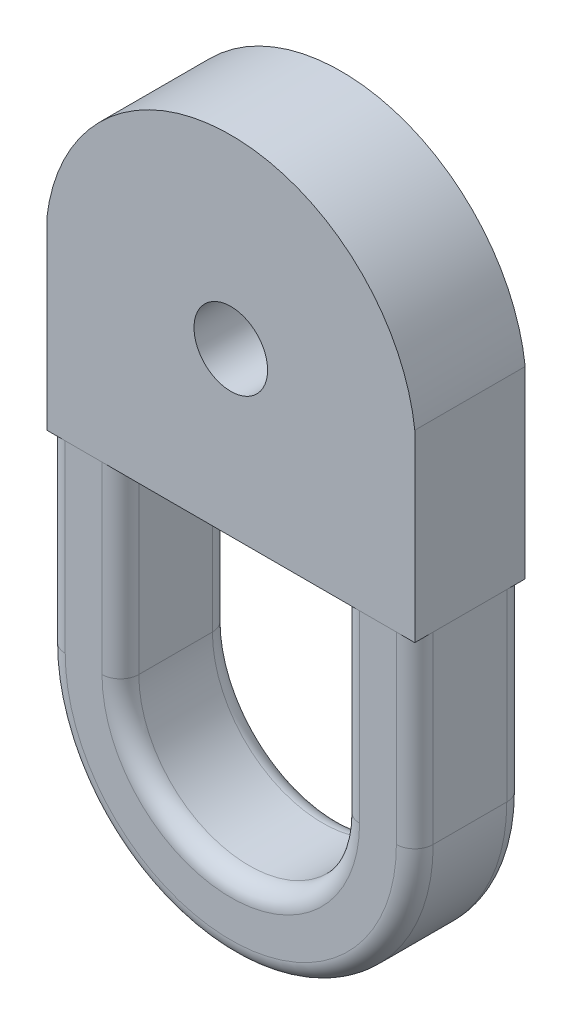
ISO-10303-21;
HEADER;
FILE_DESCRIPTION(('STEP AP214'),'2;1');
FILE_NAME('part.step','',(''),(''),'','','');
FILE_SCHEMA(('AUTOMOTIVE_DESIGN { 1 0 10303 214 1 1 1 1 }'));
ENDSEC;
DATA;
#1=APPLICATION_CONTEXT('core data for automotive mechanical design processes');
#2=APPLICATION_PROTOCOL_DEFINITION('international standard','automotive_design',2000,#1);
#3=PRODUCT_CONTEXT('',#1,'mechanical');
#4=PRODUCT('Part','Part','',(#3));
#5=PRODUCT_RELATED_PRODUCT_CATEGORY('part','',(#4));
#6=PRODUCT_DEFINITION_FORMATION('','',#4);
#7=PRODUCT_DEFINITION_CONTEXT('part definition',#1,'design');
#8=PRODUCT_DEFINITION('design','',#6,#7);
#9=PRODUCT_DEFINITION_SHAPE('','',#8);
#10=(LENGTH_UNIT() NAMED_UNIT(*) SI_UNIT(.MILLI.,.METRE.));
#11=(NAMED_UNIT(*) PLANE_ANGLE_UNIT() SI_UNIT($,.RADIAN.));
#12=(NAMED_UNIT(*) SI_UNIT($,.STERADIAN.) SOLID_ANGLE_UNIT());
#13=UNCERTAINTY_MEASURE_WITH_UNIT(LENGTH_MEASURE(1.E-05),#10,'distance_accuracy_value','');
#14=(GEOMETRIC_REPRESENTATION_CONTEXT(3) GLOBAL_UNCERTAINTY_ASSIGNED_CONTEXT((#13)) GLOBAL_UNIT_ASSIGNED_CONTEXT((#10,
#11,#12)) REPRESENTATION_CONTEXT('',''));
#15=CARTESIAN_POINT('',(0.,0.,0.));
#16=DIRECTION('',(0.,0.,1.));
#17=DIRECTION('',(1.,0.,0.));
#18=AXIS2_PLACEMENT_3D('',#15,#16,#17);
#19=CARTESIAN_POINT('',(5.,-5.,0.));
#20=DIRECTION('',(0.,0.,1.));
#21=DIRECTION('',(1.,0.,0.));
#22=AXIS2_PLACEMENT_3D('',#19,#20,#21);
#23=CYLINDRICAL_SURFACE('',#22,3.);
#24=DIRECTION('',(0.,0.,1.));
#25=VECTOR('',#24,1.);
#26=CARTESIAN_POINT('',(2.,-5.,0.));
#27=LINE('',#26,#25);
#28=CARTESIAN_POINT('',(2.,-5.,0.5));
#29=VERTEX_POINT('',#28);
#30=CARTESIAN_POINT('',(2.,-5.,2.5));
#31=VERTEX_POINT('',#30);
#32=EDGE_CURVE('E272',#29,#31,#27,.T.);
#33=ORIENTED_EDGE('',*,*,#32,.T.);
#34=CARTESIAN_POINT('',(5.,-5.,2.5));
#35=DIRECTION('',(0.,0.,1.));
#36=DIRECTION('',(1.,0.,0.));
#37=AXIS2_PLACEMENT_3D('',#34,#35,#36);
#38=CIRCLE('',#37,3.);
#39=CARTESIAN_POINT('',(8.,-5.,2.5));
#40=VERTEX_POINT('',#39);
#41=EDGE_CURVE('E238',#31,#40,#38,.T.);
#42=ORIENTED_EDGE('',*,*,#41,.T.);
#43=DIRECTION('',(0.,0.,1.));
#44=VECTOR('',#43,1.);
#45=CARTESIAN_POINT('',(8.,-5.,0.));
#46=LINE('',#45,#44);
#47=CARTESIAN_POINT('',(8.,-5.,0.5));
#48=VERTEX_POINT('',#47);
#49=EDGE_CURVE('E284',#48,#40,#46,.T.);
#50=ORIENTED_EDGE('',*,*,#49,.F.);
#51=CARTESIAN_POINT('',(5.,-5.,0.5));
#52=DIRECTION('',(0.,0.,1.));
#53=DIRECTION('',(1.,0.,0.));
#54=AXIS2_PLACEMENT_3D('',#51,#52,#53);
#55=CIRCLE('',#54,3.);
#56=EDGE_CURVE('E68',#48,#29,#55,.F.);
#57=ORIENTED_EDGE('',*,*,#56,.T.);
#58=EDGE_LOOP('',(#33,#42,#50,#57));
#59=FACE_BOUND('',#58,.T.);
#60=ADVANCED_FACE('F46',(#59),#23,.F.);
#61=CARTESIAN_POINT('',(8.,0.,0.));
#62=DIRECTION('',(1.,0.,0.));
#63=DIRECTION('',(0.,0.,-1.));
#64=AXIS2_PLACEMENT_3D('',#61,#62,#63);
#65=PLANE('',#64);
#66=ORIENTED_EDGE('',*,*,#49,.T.);
#67=DIRECTION('',(0.,1.,0.));
#68=VECTOR('',#67,1.);
#69=CARTESIAN_POINT('',(8.,0.,2.5));
#70=LINE('',#69,#68);
#71=CARTESIAN_POINT('',(8.,0.,2.5));
#72=VERTEX_POINT('',#71);
#73=EDGE_CURVE('E234',#40,#72,#70,.T.);
#74=ORIENTED_EDGE('',*,*,#73,.T.);
#75=DIRECTION('',(0.,0.,1.));
#76=VECTOR('',#75,1.);
#77=CARTESIAN_POINT('',(8.,0.,0.));
#78=LINE('',#77,#76);
#79=CARTESIAN_POINT('',(8.,0.,0.5));
#80=VERTEX_POINT('',#79);
#81=EDGE_CURVE('E317',#80,#72,#78,.T.);
#82=ORIENTED_EDGE('',*,*,#81,.F.);
#83=DIRECTION('',(0.,1.,0.));
#84=VECTOR('',#83,1.);
#85=CARTESIAN_POINT('',(8.,0.,0.5));
#86=LINE('',#85,#84);
#87=EDGE_CURVE('E232',#80,#48,#86,.F.);
#88=ORIENTED_EDGE('',*,*,#87,.T.);
#89=EDGE_LOOP('',(#66,#74,#82,#88));
#90=FACE_BOUND('',#89,.T.);
#91=ADVANCED_FACE('F346',(#90),#65,.F.);
#92=CARTESIAN_POINT('',(0.,0.,0.));
#93=DIRECTION('',(0.,-1.,0.));
#94=DIRECTION('',(1.,0.,0.));
#95=AXIS2_PLACEMENT_3D('',#92,#93,#94);
#96=PLANE('',#95);
#97=DIRECTION('',(0.,0.,1.));
#98=VECTOR('',#97,1.);
#99=CARTESIAN_POINT('',(10.,0.,0.));
#100=LINE('',#99,#98);
#101=CARTESIAN_POINT('',(10.,0.,0.5));
#102=VERTEX_POINT('',#101);
#103=CARTESIAN_POINT('',(10.,0.,2.5));
#104=VERTEX_POINT('',#103);
#105=EDGE_CURVE('E310',#102,#104,#100,.T.);
#106=ORIENTED_EDGE('',*,*,#105,.F.);
#107=CARTESIAN_POINT('',(9.5,0.,0.5));
#108=DIRECTION('',(0.,-1.,0.));
#109=DIRECTION('',(1.,0.,0.));
#110=AXIS2_PLACEMENT_3D('',#107,#108,#109);
#111=CIRCLE('',#110,0.5);
#112=CARTESIAN_POINT('',(9.5,0.,0.));
#113=VERTEX_POINT('',#112);
#114=EDGE_CURVE('E230',#102,#113,#111,.F.);
#115=ORIENTED_EDGE('',*,*,#114,.T.);
#116=DIRECTION('',(1.,0.,0.));
#117=VECTOR('',#116,1.);
#118=CARTESIAN_POINT('',(0.,0.,0.));
#119=LINE('',#118,#117);
#120=CARTESIAN_POINT('',(8.5,0.,0.));
#121=VERTEX_POINT('',#120);
#122=EDGE_CURVE('E278',#121,#113,#119,.T.);
#123=ORIENTED_EDGE('',*,*,#122,.F.);
#124=CARTESIAN_POINT('',(8.5,0.,0.5));
#125=DIRECTION('',(0.,-1.,0.));
#126=DIRECTION('',(1.,0.,0.));
#127=AXIS2_PLACEMENT_3D('',#124,#125,#126);
#128=CIRCLE('',#127,0.5);
#129=EDGE_CURVE('E226',#121,#80,#128,.F.);
#130=ORIENTED_EDGE('',*,*,#129,.T.);
#131=ORIENTED_EDGE('',*,*,#81,.T.);
#132=CARTESIAN_POINT('',(8.5,0.,2.5));
#133=DIRECTION('',(0.,-1.,0.));
#134=DIRECTION('',(1.,0.,0.));
#135=AXIS2_PLACEMENT_3D('',#132,#133,#134);
#136=CIRCLE('',#135,0.5);
#137=CARTESIAN_POINT('',(8.5,0.,3.));
#138=VERTEX_POINT('',#137);
#139=EDGE_CURVE('E228',#72,#138,#136,.F.);
#140=ORIENTED_EDGE('',*,*,#139,.T.);
#141=DIRECTION('',(1.,0.,0.));
#142=VECTOR('',#141,1.);
#143=CARTESIAN_POINT('',(0.,0.,3.));
#144=LINE('',#143,#142);
#145=CARTESIAN_POINT('',(9.5,0.,3.));
#146=VERTEX_POINT('',#145);
#147=EDGE_CURVE('E181',#138,#146,#144,.T.);
#148=ORIENTED_EDGE('',*,*,#147,.T.);
#149=CARTESIAN_POINT('',(9.5,0.,2.5));
#150=DIRECTION('',(0.,-1.,0.));
#151=DIRECTION('',(1.,0.,0.));
#152=AXIS2_PLACEMENT_3D('',#149,#150,#151);
#153=CIRCLE('',#152,0.5);
#154=EDGE_CURVE('E224',#146,#104,#153,.F.);
#155=ORIENTED_EDGE('',*,*,#154,.T.);
#156=EDGE_LOOP('',(#106,#115,#123,#130,#131,#140,#148,#155));
#157=FACE_BOUND('',#156,.T.);
#158=ADVANCED_FACE('F296',(#157),#96,.F.);
#159=CARTESIAN_POINT('',(10.,0.,0.));
#160=DIRECTION('',(-1.,0.,0.));
#161=DIRECTION('',(0.,-1.,0.));
#162=AXIS2_PLACEMENT_3D('',#159,#160,#161);
#163=PLANE('',#162);
#164=DIRECTION('',(0.,0.,1.));
#165=VECTOR('',#164,1.);
#166=CARTESIAN_POINT('',(10.,-5.,0.));
#167=LINE('',#166,#165);
#168=CARTESIAN_POINT('',(10.,-5.,0.5));
#169=VERTEX_POINT('',#168);
#170=CARTESIAN_POINT('',(10.,-5.,2.5));
#171=VERTEX_POINT('',#170);
#172=EDGE_CURVE('E308',#169,#171,#167,.T.);
#173=ORIENTED_EDGE('',*,*,#172,.F.);
#174=DIRECTION('',(0.,-1.,0.));
#175=VECTOR('',#174,1.);
#176=CARTESIAN_POINT('',(10.,0.,0.5));
#177=LINE('',#176,#175);
#178=EDGE_CURVE('E222',#169,#102,#177,.F.);
#179=ORIENTED_EDGE('',*,*,#178,.T.);
#180=ORIENTED_EDGE('',*,*,#105,.T.);
#181=DIRECTION('',(0.,-1.,0.));
#182=VECTOR('',#181,1.);
#183=CARTESIAN_POINT('',(10.,-5.,2.5));
#184=LINE('',#183,#182);
#185=EDGE_CURVE('E220',#104,#171,#184,.T.);
#186=ORIENTED_EDGE('',*,*,#185,.T.);
#187=EDGE_LOOP('',(#173,#179,#180,#186));
#188=FACE_BOUND('',#187,.T.);
#189=ADVANCED_FACE('F307',(#188),#163,.F.);
#190=CARTESIAN_POINT('',(5.,-5.,0.));
#191=DIRECTION('',(0.,0.,1.));
#192=DIRECTION('',(1.,0.,0.));
#193=AXIS2_PLACEMENT_3D('',#190,#191,#192);
#194=CYLINDRICAL_SURFACE('',#193,5.);
#195=ORIENTED_EDGE('',*,*,#172,.T.);
#196=CARTESIAN_POINT('',(5.,-5.,2.5));
#197=DIRECTION('',(0.,0.,1.));
#198=DIRECTION('',(1.,0.,0.));
#199=AXIS2_PLACEMENT_3D('',#196,#197,#198);
#200=CIRCLE('',#199,5.);
#201=CARTESIAN_POINT('',(0.,-5.,2.5));
#202=VERTEX_POINT('',#201);
#203=EDGE_CURVE('E204',#171,#202,#200,.F.);
#204=ORIENTED_EDGE('',*,*,#203,.T.);
#205=DIRECTION('',(0.,0.,1.));
#206=VECTOR('',#205,1.);
#207=CARTESIAN_POINT('',(0.,-5.,0.));
#208=LINE('',#207,#206);
#209=CARTESIAN_POINT('',(0.,-5.,0.5));
#210=VERTEX_POINT('',#209);
#211=EDGE_CURVE('E276',#210,#202,#208,.T.);
#212=ORIENTED_EDGE('',*,*,#211,.F.);
#213=CARTESIAN_POINT('',(5.,-5.,0.5));
#214=DIRECTION('',(0.,0.,1.));
#215=DIRECTION('',(1.,0.,0.));
#216=AXIS2_PLACEMENT_3D('',#213,#214,#215);
#217=CIRCLE('',#216,5.);
#218=EDGE_CURVE('E172',#210,#169,#217,.T.);
#219=ORIENTED_EDGE('',*,*,#218,.T.);
#220=EDGE_LOOP('',(#195,#204,#212,#219));
#221=FACE_BOUND('',#220,.T.);
#222=ADVANCED_FACE('F312',(#221),#194,.T.);
#223=CARTESIAN_POINT('',(0.,0.,0.));
#224=DIRECTION('',(-1.,0.,0.));
#225=DIRECTION('',(0.,-1.,0.));
#226=AXIS2_PLACEMENT_3D('',#223,#224,#225);
#227=PLANE('',#226);
#228=ORIENTED_EDGE('',*,*,#211,.T.);
#229=DIRECTION('',(0.,-1.,0.));
#230=VECTOR('',#229,1.);
#231=CARTESIAN_POINT('',(0.,0.,2.5));
#232=LINE('',#231,#230);
#233=CARTESIAN_POINT('',(0.,0.,2.5));
#234=VERTEX_POINT('',#233);
#235=EDGE_CURVE('E191',#202,#234,#232,.F.);
#236=ORIENTED_EDGE('',*,*,#235,.T.);
#237=DIRECTION('',(0.,0.,1.));
#238=VECTOR('',#237,1.);
#239=CARTESIAN_POINT('',(0.,0.,0.));
#240=LINE('',#239,#238);
#241=CARTESIAN_POINT('',(0.,0.,0.5));
#242=VERTEX_POINT('',#241);
#243=EDGE_CURVE('E168',#242,#234,#240,.T.);
#244=ORIENTED_EDGE('',*,*,#243,.F.);
#245=DIRECTION('',(0.,-1.,0.));
#246=VECTOR('',#245,1.);
#247=CARTESIAN_POINT('',(0.,-5.,0.5));
#248=LINE('',#247,#246);
#249=EDGE_CURVE('E188',#242,#210,#248,.T.);
#250=ORIENTED_EDGE('',*,*,#249,.T.);
#251=EDGE_LOOP('',(#228,#236,#244,#250));
#252=FACE_BOUND('',#251,.T.);
#253=ADVANCED_FACE('F334',(#252),#227,.T.);
#254=CARTESIAN_POINT('',(0.,0.,0.));
#255=DIRECTION('',(0.,-1.,0.));
#256=DIRECTION('',(1.,0.,0.));
#257=AXIS2_PLACEMENT_3D('',#254,#255,#256);
#258=PLANE('',#257);
#259=ORIENTED_EDGE('',*,*,#243,.T.);
#260=CARTESIAN_POINT('',(0.5,0.,2.5));
#261=DIRECTION('',(0.,-1.,0.));
#262=DIRECTION('',(1.,0.,0.));
#263=AXIS2_PLACEMENT_3D('',#260,#261,#262);
#264=CIRCLE('',#263,0.5);
#265=CARTESIAN_POINT('',(0.5,0.,3.));
#266=VERTEX_POINT('',#265);
#267=EDGE_CURVE('E162',#234,#266,#264,.F.);
#268=ORIENTED_EDGE('',*,*,#267,.T.);
#269=DIRECTION('',(1.,0.,0.));
#270=VECTOR('',#269,1.);
#271=CARTESIAN_POINT('',(0.,0.,3.));
#272=LINE('',#271,#270);
#273=CARTESIAN_POINT('',(1.5,0.,3.));
#274=VERTEX_POINT('',#273);
#275=EDGE_CURVE('E165',#266,#274,#272,.T.);
#276=ORIENTED_EDGE('',*,*,#275,.T.);
#277=CARTESIAN_POINT('',(1.5,0.,2.5));
#278=DIRECTION('',(0.,-1.,0.));
#279=DIRECTION('',(1.,0.,0.));
#280=AXIS2_PLACEMENT_3D('',#277,#278,#279);
#281=CIRCLE('',#280,0.5);
#282=CARTESIAN_POINT('',(2.,0.,2.5));
#283=VERTEX_POINT('',#282);
#284=EDGE_CURVE('E200',#274,#283,#281,.F.);
#285=ORIENTED_EDGE('',*,*,#284,.T.);
#286=DIRECTION('',(0.,0.,1.));
#287=VECTOR('',#286,1.);
#288=CARTESIAN_POINT('',(2.,0.,0.));
#289=LINE('',#288,#287);
#290=CARTESIAN_POINT('',(2.,0.,0.5));
#291=VERTEX_POINT('',#290);
#292=EDGE_CURVE('E271',#291,#283,#289,.T.);
#293=ORIENTED_EDGE('',*,*,#292,.F.);
#294=CARTESIAN_POINT('',(1.5,0.,0.5));
#295=DIRECTION('',(0.,-1.,0.));
#296=DIRECTION('',(1.,0.,0.));
#297=AXIS2_PLACEMENT_3D('',#294,#295,#296);
#298=CIRCLE('',#297,0.5);
#299=CARTESIAN_POINT('',(1.5,0.,0.));
#300=VERTEX_POINT('',#299);
#301=EDGE_CURVE('E198',#291,#300,#298,.F.);
#302=ORIENTED_EDGE('',*,*,#301,.T.);
#303=DIRECTION('',(1.,0.,0.));
#304=VECTOR('',#303,1.);
#305=CARTESIAN_POINT('',(0.,0.,0.));
#306=LINE('',#305,#304);
#307=CARTESIAN_POINT('',(0.5,0.,0.));
#308=VERTEX_POINT('',#307);
#309=EDGE_CURVE('E299',#308,#300,#306,.T.);
#310=ORIENTED_EDGE('',*,*,#309,.F.);
#311=CARTESIAN_POINT('',(0.5,0.,0.5));
#312=DIRECTION('',(0.,-1.,0.));
#313=DIRECTION('',(1.,0.,0.));
#314=AXIS2_PLACEMENT_3D('',#311,#312,#313);
#315=CIRCLE('',#314,0.5);
#316=EDGE_CURVE('E173',#308,#242,#315,.F.);
#317=ORIENTED_EDGE('',*,*,#316,.T.);
#318=EDGE_LOOP('',(#259,#268,#276,#285,#293,#302,#310,#317));
#319=FACE_BOUND('',#318,.T.);
#320=ADVANCED_FACE('F164',(#319),#258,.F.);
#321=CARTESIAN_POINT('',(2.,0.,0.));
#322=DIRECTION('',(1.,0.,0.));
#323=DIRECTION('',(0.,1.,0.));
#324=AXIS2_PLACEMENT_3D('',#321,#322,#323);
#325=PLANE('',#324);
#326=ORIENTED_EDGE('',*,*,#292,.T.);
#327=DIRECTION('',(0.,1.,0.));
#328=VECTOR('',#327,1.);
#329=CARTESIAN_POINT('',(2.,0.,2.5));
#330=LINE('',#329,#328);
#331=EDGE_CURVE('E12',#283,#31,#330,.F.);
#332=ORIENTED_EDGE('',*,*,#331,.T.);
#333=ORIENTED_EDGE('',*,*,#32,.F.);
#334=DIRECTION('',(0.,1.,0.));
#335=VECTOR('',#334,1.);
#336=CARTESIAN_POINT('',(2.,0.,0.5));
#337=LINE('',#336,#335);
#338=EDGE_CURVE('E55',#29,#291,#337,.T.);
#339=ORIENTED_EDGE('',*,*,#338,.T.);
#340=EDGE_LOOP('',(#326,#332,#333,#339));
#341=FACE_BOUND('',#340,.T.);
#342=ADVANCED_FACE('F270',(#341),#325,.T.);
#343=CARTESIAN_POINT('',(0.,0.,0.));
#344=DIRECTION('',(0.,0.,1.));
#345=DIRECTION('',(1.,0.,0.));
#346=AXIS2_PLACEMENT_3D('',#343,#344,#345);
#347=PLANE('',#346);
#348=ORIENTED_EDGE('',*,*,#122,.T.);
#349=DIRECTION('',(0.,-1.,0.));
#350=VECTOR('',#349,1.);
#351=CARTESIAN_POINT('',(9.5,0.,0.));
#352=LINE('',#351,#350);
#353=CARTESIAN_POINT('',(9.5,-5.,0.));
#354=VERTEX_POINT('',#353);
#355=EDGE_CURVE('E217',#113,#354,#352,.T.);
#356=ORIENTED_EDGE('',*,*,#355,.T.);
#357=CARTESIAN_POINT('',(5.,-5.,0.));
#358=DIRECTION('',(0.,0.,1.));
#359=DIRECTION('',(1.,0.,0.));
#360=AXIS2_PLACEMENT_3D('',#357,#358,#359);
#361=CIRCLE('',#360,4.5);
#362=CARTESIAN_POINT('',(0.500000000000001,-5.,0.));
#363=VERTEX_POINT('',#362);
#364=EDGE_CURVE('E215',#354,#363,#361,.F.);
#365=ORIENTED_EDGE('',*,*,#364,.T.);
#366=DIRECTION('',(0.,-1.,0.));
#367=VECTOR('',#366,1.);
#368=CARTESIAN_POINT('',(0.5,0.,0.));
#369=LINE('',#368,#367);
#370=EDGE_CURVE('E213',#363,#308,#369,.F.);
#371=ORIENTED_EDGE('',*,*,#370,.T.);
#372=ORIENTED_EDGE('',*,*,#309,.T.);
#373=DIRECTION('',(0.,1.,0.));
#374=VECTOR('',#373,1.);
#375=CARTESIAN_POINT('',(1.5,-5.,0.));
#376=LINE('',#375,#374);
#377=CARTESIAN_POINT('',(1.5,-5.,0.));
#378=VERTEX_POINT('',#377);
#379=EDGE_CURVE('E206',#300,#378,#376,.F.);
#380=ORIENTED_EDGE('',*,*,#379,.T.);
#381=CARTESIAN_POINT('',(5.,-5.,0.));
#382=DIRECTION('',(0.,0.,1.));
#383=DIRECTION('',(1.,0.,0.));
#384=AXIS2_PLACEMENT_3D('',#381,#382,#383);
#385=CIRCLE('',#384,3.5);
#386=CARTESIAN_POINT('',(8.5,-5.,0.));
#387=VERTEX_POINT('',#386);
#388=EDGE_CURVE('E208',#378,#387,#385,.T.);
#389=ORIENTED_EDGE('',*,*,#388,.T.);
#390=DIRECTION('',(0.,1.,0.));
#391=VECTOR('',#390,1.);
#392=CARTESIAN_POINT('',(8.5,0.,0.));
#393=LINE('',#392,#391);
#394=EDGE_CURVE('E210',#387,#121,#393,.T.);
#395=ORIENTED_EDGE('',*,*,#394,.T.);
#396=EDGE_LOOP('',(#348,#356,#365,#371,#372,#380,#389,#395));
#397=FACE_BOUND('',#396,.T.);
#398=ADVANCED_FACE('F326',(#397),#347,.F.);
#399=CARTESIAN_POINT('',(0.,0.,3.));
#400=DIRECTION('',(0.,0.,1.));
#401=DIRECTION('',(1.,0.,0.));
#402=AXIS2_PLACEMENT_3D('',#399,#400,#401);
#403=PLANE('',#402);
#404=ORIENTED_EDGE('',*,*,#275,.F.);
#405=DIRECTION('',(0.,-1.,0.));
#406=VECTOR('',#405,1.);
#407=CARTESIAN_POINT('',(0.5,0.,3.));
#408=LINE('',#407,#406);
#409=CARTESIAN_POINT('',(0.500000000000001,-5.,3.));
#410=VERTEX_POINT('',#409);
#411=EDGE_CURVE('E178',#266,#410,#408,.T.);
#412=ORIENTED_EDGE('',*,*,#411,.T.);
#413=CARTESIAN_POINT('',(5.,-5.,3.));
#414=DIRECTION('',(0.,0.,1.));
#415=DIRECTION('',(1.,0.,0.));
#416=AXIS2_PLACEMENT_3D('',#413,#414,#415);
#417=CIRCLE('',#416,4.5);
#418=CARTESIAN_POINT('',(9.5,-5.,3.));
#419=VERTEX_POINT('',#418);
#420=EDGE_CURVE('E189',#410,#419,#417,.T.);
#421=ORIENTED_EDGE('',*,*,#420,.T.);
#422=DIRECTION('',(0.,-1.,0.));
#423=VECTOR('',#422,1.);
#424=CARTESIAN_POINT('',(9.5,0.,3.));
#425=LINE('',#424,#423);
#426=EDGE_CURVE('E193',#419,#146,#425,.F.);
#427=ORIENTED_EDGE('',*,*,#426,.T.);
#428=ORIENTED_EDGE('',*,*,#147,.F.);
#429=DIRECTION('',(0.,1.,0.));
#430=VECTOR('',#429,1.);
#431=CARTESIAN_POINT('',(8.5,-5.,3.));
#432=LINE('',#431,#430);
#433=CARTESIAN_POINT('',(8.5,-5.,3.));
#434=VERTEX_POINT('',#433);
#435=EDGE_CURVE('E286',#138,#434,#432,.F.);
#436=ORIENTED_EDGE('',*,*,#435,.T.);
#437=CARTESIAN_POINT('',(5.,-5.,3.));
#438=DIRECTION('',(0.,0.,1.));
#439=DIRECTION('',(1.,0.,0.));
#440=AXIS2_PLACEMENT_3D('',#437,#438,#439);
#441=CIRCLE('',#440,3.5);
#442=CARTESIAN_POINT('',(1.5,-5.,3.));
#443=VERTEX_POINT('',#442);
#444=EDGE_CURVE('E283',#434,#443,#441,.F.);
#445=ORIENTED_EDGE('',*,*,#444,.T.);
#446=DIRECTION('',(0.,1.,0.));
#447=VECTOR('',#446,1.);
#448=CARTESIAN_POINT('',(1.5,0.,3.));
#449=LINE('',#448,#447);
#450=EDGE_CURVE('E180',#443,#274,#449,.T.);
#451=ORIENTED_EDGE('',*,*,#450,.T.);
#452=EDGE_LOOP('',(#404,#412,#421,#427,#428,#436,#445,#451));
#453=FACE_BOUND('',#452,.T.);
#454=ADVANCED_FACE('F177',(#453),#403,.T.);
#455=CARTESIAN_POINT('',(9.5,0.,2.5));
#456=DIRECTION('',(0.,1.,0.));
#457=DIRECTION('',(-1.,0.,0.));
#458=AXIS2_PLACEMENT_3D('',#455,#456,#457);
#459=CYLINDRICAL_SURFACE('',#458,0.5);
#460=ORIENTED_EDGE('',*,*,#154,.F.);
#461=ORIENTED_EDGE('',*,*,#426,.F.);
#462=CARTESIAN_POINT('',(9.5,-5.,2.5));
#463=DIRECTION('',(0.,-1.,0.));
#464=DIRECTION('',(0.,0.,-1.));
#465=AXIS2_PLACEMENT_3D('',#462,#463,#464);
#466=CIRCLE('',#465,0.5);
#467=EDGE_CURVE('E182',#171,#419,#466,.T.);
#468=ORIENTED_EDGE('',*,*,#467,.F.);
#469=ORIENTED_EDGE('',*,*,#185,.F.);
#470=EDGE_LOOP('',(#460,#461,#468,#469));
#471=FACE_BOUND('',#470,.T.);
#472=ADVANCED_FACE('F302',(#471),#459,.T.);
#473=CARTESIAN_POINT('',(5.,-5.,2.5));
#474=DIRECTION('',(0.,0.,1.));
#475=DIRECTION('',(1.,0.,0.));
#476=AXIS2_PLACEMENT_3D('',#473,#474,#475);
#477=TOROIDAL_SURFACE('',#476,4.5,0.5);
#478=ORIENTED_EDGE('',*,*,#467,.T.);
#479=ORIENTED_EDGE('',*,*,#420,.F.);
#480=CARTESIAN_POINT('',(0.500000000000001,-5.,2.5));
#481=DIRECTION('',(0.,1.,0.));
#482=DIRECTION('',(0.,0.,1.));
#483=AXIS2_PLACEMENT_3D('',#480,#481,#482);
#484=CIRCLE('',#483,0.5);
#485=EDGE_CURVE('E186',#202,#410,#484,.T.);
#486=ORIENTED_EDGE('',*,*,#485,.F.);
#487=ORIENTED_EDGE('',*,*,#203,.F.);
#488=EDGE_LOOP('',(#478,#479,#486,#487));
#489=FACE_BOUND('',#488,.T.);
#490=ADVANCED_FACE('F336',(#489),#477,.T.);
#491=CARTESIAN_POINT('',(0.5,0.,2.5));
#492=DIRECTION('',(0.,-1.,0.));
#493=DIRECTION('',(1.,0.,0.));
#494=AXIS2_PLACEMENT_3D('',#491,#492,#493);
#495=CYLINDRICAL_SURFACE('',#494,0.5);
#496=ORIENTED_EDGE('',*,*,#267,.F.);
#497=ORIENTED_EDGE('',*,*,#235,.F.);
#498=ORIENTED_EDGE('',*,*,#485,.T.);
#499=ORIENTED_EDGE('',*,*,#411,.F.);
#500=EDGE_LOOP('',(#496,#497,#498,#499));
#501=FACE_BOUND('',#500,.T.);
#502=ADVANCED_FACE('F184',(#501),#495,.T.);
#503=CARTESIAN_POINT('',(0.5,0.,0.5));
#504=DIRECTION('',(0.,1.,0.));
#505=DIRECTION('',(-1.,0.,0.));
#506=AXIS2_PLACEMENT_3D('',#503,#504,#505);
#507=CYLINDRICAL_SURFACE('',#506,0.5);
#508=ORIENTED_EDGE('',*,*,#316,.F.);
#509=ORIENTED_EDGE('',*,*,#370,.F.);
#510=CARTESIAN_POINT('',(0.500000000000001,-5.,0.5));
#511=DIRECTION('',(0.,-1.,0.));
#512=DIRECTION('',(0.,0.,-1.));
#513=AXIS2_PLACEMENT_3D('',#510,#511,#512);
#514=CIRCLE('',#513,0.5);
#515=EDGE_CURVE('E242',#210,#363,#514,.T.);
#516=ORIENTED_EDGE('',*,*,#515,.F.);
#517=ORIENTED_EDGE('',*,*,#249,.F.);
#518=EDGE_LOOP('',(#508,#509,#516,#517));
#519=FACE_BOUND('',#518,.T.);
#520=ADVANCED_FACE('F331',(#519),#507,.T.);
#521=CARTESIAN_POINT('',(5.,-5.,0.5));
#522=DIRECTION('',(0.,0.,1.));
#523=DIRECTION('',(1.,0.,0.));
#524=AXIS2_PLACEMENT_3D('',#521,#522,#523);
#525=TOROIDAL_SURFACE('',#524,4.5,0.5);
#526=ORIENTED_EDGE('',*,*,#515,.T.);
#527=ORIENTED_EDGE('',*,*,#364,.F.);
#528=CARTESIAN_POINT('',(9.5,-5.,0.5));
#529=DIRECTION('',(0.,1.,0.));
#530=DIRECTION('',(0.,0.,1.));
#531=AXIS2_PLACEMENT_3D('',#528,#529,#530);
#532=CIRCLE('',#531,0.5);
#533=EDGE_CURVE('E245',#169,#354,#532,.T.);
#534=ORIENTED_EDGE('',*,*,#533,.F.);
#535=ORIENTED_EDGE('',*,*,#218,.F.);
#536=EDGE_LOOP('',(#526,#527,#534,#535));
#537=FACE_BOUND('',#536,.T.);
#538=ADVANCED_FACE('F400',(#537),#525,.T.);
#539=CARTESIAN_POINT('',(9.5,0.,0.5));
#540=DIRECTION('',(0.,-1.,0.));
#541=DIRECTION('',(1.,0.,0.));
#542=AXIS2_PLACEMENT_3D('',#539,#540,#541);
#543=CYLINDRICAL_SURFACE('',#542,0.5);
#544=ORIENTED_EDGE('',*,*,#114,.F.);
#545=ORIENTED_EDGE('',*,*,#178,.F.);
#546=ORIENTED_EDGE('',*,*,#533,.T.);
#547=ORIENTED_EDGE('',*,*,#355,.F.);
#548=EDGE_LOOP('',(#544,#545,#546,#547));
#549=FACE_BOUND('',#548,.T.);
#550=ADVANCED_FACE('F409',(#549),#543,.T.);
#551=CARTESIAN_POINT('',(1.5,0.,2.5));
#552=DIRECTION('',(0.,1.,0.));
#553=DIRECTION('',(-1.,0.,0.));
#554=AXIS2_PLACEMENT_3D('',#551,#552,#553);
#555=CYLINDRICAL_SURFACE('',#554,0.5);
#556=ORIENTED_EDGE('',*,*,#284,.F.);
#557=ORIENTED_EDGE('',*,*,#450,.F.);
#558=CARTESIAN_POINT('',(1.5,-5.,2.5));
#559=DIRECTION('',(0.,-1.,0.));
#560=DIRECTION('',(0.,0.,-1.));
#561=AXIS2_PLACEMENT_3D('',#558,#559,#560);
#562=CIRCLE('',#561,0.5);
#563=EDGE_CURVE('E247',#31,#443,#562,.T.);
#564=ORIENTED_EDGE('',*,*,#563,.F.);
#565=ORIENTED_EDGE('',*,*,#331,.F.);
#566=EDGE_LOOP('',(#556,#557,#564,#565));
#567=FACE_BOUND('',#566,.T.);
#568=ADVANCED_FACE('F419',(#567),#555,.T.);
#569=CARTESIAN_POINT('',(5.,-5.,2.5));
#570=DIRECTION('',(0.,0.,1.));
#571=DIRECTION('',(1.,0.,0.));
#572=AXIS2_PLACEMENT_3D('',#569,#570,#571);
#573=TOROIDAL_SURFACE('',#572,3.5,0.5);
#574=ORIENTED_EDGE('',*,*,#563,.T.);
#575=ORIENTED_EDGE('',*,*,#444,.F.);
#576=CARTESIAN_POINT('',(8.5,-5.,2.5));
#577=DIRECTION('',(0.,1.,0.));
#578=DIRECTION('',(0.,0.,1.));
#579=AXIS2_PLACEMENT_3D('',#576,#577,#578);
#580=CIRCLE('',#579,0.5);
#581=EDGE_CURVE('E250',#40,#434,#580,.T.);
#582=ORIENTED_EDGE('',*,*,#581,.F.);
#583=ORIENTED_EDGE('',*,*,#41,.F.);
#584=EDGE_LOOP('',(#574,#575,#582,#583));
#585=FACE_BOUND('',#584,.T.);
#586=ADVANCED_FACE('F429',(#585),#573,.T.);
#587=CARTESIAN_POINT('',(8.5,0.,2.5));
#588=DIRECTION('',(0.,-1.,0.));
#589=DIRECTION('',(0.,0.,-1.));
#590=AXIS2_PLACEMENT_3D('',#587,#588,#589);
#591=CYLINDRICAL_SURFACE('',#590,0.5);
#592=ORIENTED_EDGE('',*,*,#581,.T.);
#593=ORIENTED_EDGE('',*,*,#435,.F.);
#594=ORIENTED_EDGE('',*,*,#139,.F.);
#595=ORIENTED_EDGE('',*,*,#73,.F.);
#596=EDGE_LOOP('',(#592,#593,#594,#595));
#597=FACE_BOUND('',#596,.T.);
#598=ADVANCED_FACE('F439',(#597),#591,.T.);
#599=CARTESIAN_POINT('',(1.5,0.,0.5));
#600=DIRECTION('',(0.,-1.,0.));
#601=DIRECTION('',(1.,0.,0.));
#602=AXIS2_PLACEMENT_3D('',#599,#600,#601);
#603=CYLINDRICAL_SURFACE('',#602,0.5);
#604=ORIENTED_EDGE('',*,*,#301,.F.);
#605=ORIENTED_EDGE('',*,*,#338,.F.);
#606=CARTESIAN_POINT('',(1.5,-5.,0.5));
#607=DIRECTION('',(0.,-1.,0.));
#608=DIRECTION('',(0.,0.,-1.));
#609=AXIS2_PLACEMENT_3D('',#606,#607,#608);
#610=CIRCLE('',#609,0.5);
#611=EDGE_CURVE('E50',#378,#29,#610,.T.);
#612=ORIENTED_EDGE('',*,*,#611,.F.);
#613=ORIENTED_EDGE('',*,*,#379,.F.);
#614=EDGE_LOOP('',(#604,#605,#612,#613));
#615=FACE_BOUND('',#614,.T.);
#616=ADVANCED_FACE('F48',(#615),#603,.T.);
#617=CARTESIAN_POINT('',(5.,-5.,0.5));
#618=DIRECTION('',(0.,0.,1.));
#619=DIRECTION('',(1.,0.,0.));
#620=AXIS2_PLACEMENT_3D('',#617,#618,#619);
#621=TOROIDAL_SURFACE('',#620,3.5,0.5);
#622=ORIENTED_EDGE('',*,*,#611,.T.);
#623=ORIENTED_EDGE('',*,*,#56,.F.);
#624=CARTESIAN_POINT('',(8.5,-5.,0.5));
#625=DIRECTION('',(0.,1.,0.));
#626=DIRECTION('',(0.,0.,1.));
#627=AXIS2_PLACEMENT_3D('',#624,#625,#626);
#628=CIRCLE('',#627,0.5);
#629=EDGE_CURVE('E254',#387,#48,#628,.T.);
#630=ORIENTED_EDGE('',*,*,#629,.F.);
#631=ORIENTED_EDGE('',*,*,#388,.F.);
#632=EDGE_LOOP('',(#622,#623,#630,#631));
#633=FACE_BOUND('',#632,.T.);
#634=ADVANCED_FACE('F264',(#633),#621,.T.);
#635=CARTESIAN_POINT('',(8.5,0.,0.5));
#636=DIRECTION('',(0.,1.,0.));
#637=DIRECTION('',(0.,0.,1.));
#638=AXIS2_PLACEMENT_3D('',#635,#636,#637);
#639=CYLINDRICAL_SURFACE('',#638,0.5);
#640=ORIENTED_EDGE('',*,*,#629,.T.);
#641=ORIENTED_EDGE('',*,*,#87,.F.);
#642=ORIENTED_EDGE('',*,*,#129,.F.);
#643=ORIENTED_EDGE('',*,*,#394,.F.);
#644=EDGE_LOOP('',(#640,#641,#642,#643));
#645=FACE_BOUND('',#644,.T.);
#646=ADVANCED_FACE('F465',(#645),#639,.T.);
#647=CLOSED_SHELL('',(#60,#91,#158,#189,#222,#253,#320,#342,#398,#454,#472,#490,#502,#520,#538,
#550,#568,#586,#598,#616,#634,#646));
#648=MANIFOLD_SOLID_BREP('B2',#647);
#649=CARTESIAN_POINT('',(5.,4.41366698841699,3.));
#650=DIRECTION('',(0.,0.,-1.));
#651=DIRECTION('',(-1.,0.,0.));
#652=AXIS2_PLACEMENT_3D('',#649,#650,#651);
#653=PLANE('',#652);
#654=DIRECTION('',(1.,0.,0.));
#655=VECTOR('',#654,1.);
#656=CARTESIAN_POINT('',(10.,0.,3.));
#657=LINE('',#656,#655);
#658=CARTESIAN_POINT('',(0.,0.,3.));
#659=VERTEX_POINT('',#658);
#660=CARTESIAN_POINT('',(10.,0.,3.));
#661=VERTEX_POINT('',#660);
#662=EDGE_CURVE('E607',#659,#661,#657,.T.);
#663=ORIENTED_EDGE('',*,*,#662,.T.);
#664=DIRECTION('',(0.,1.,0.));
#665=VECTOR('',#664,1.);
#666=CARTESIAN_POINT('',(10.,5.,3.));
#667=LINE('',#666,#665);
#668=CARTESIAN_POINT('',(9.99999999999999,5.,3.));
#669=VERTEX_POINT('',#668);
#670=EDGE_CURVE('E602',#661,#669,#667,.T.);
#671=ORIENTED_EDGE('',*,*,#670,.T.);
#672=CARTESIAN_POINT('',(5.,4.41366698841699,3.));
#673=DIRECTION('',(0.,0.,1.));
#674=DIRECTION('',(-1.,0.,0.));
#675=AXIS2_PLACEMENT_3D('',#672,#673,#674);
#676=CIRCLE('',#675,5.0342612566763);
#677=CARTESIAN_POINT('',(0.,5.,3.));
#678=VERTEX_POINT('',#677);
#679=EDGE_CURVE('E605',#669,#678,#676,.T.);
#680=ORIENTED_EDGE('',*,*,#679,.T.);
#681=DIRECTION('',(0.,-1.,0.));
#682=VECTOR('',#681,1.);
#683=CARTESIAN_POINT('',(0.,0.,3.));
#684=LINE('',#683,#682);
#685=EDGE_CURVE('E572',#678,#659,#684,.T.);
#686=ORIENTED_EDGE('',*,*,#685,.T.);
#687=EDGE_LOOP('',(#663,#671,#680,#686));
#688=FACE_BOUND('',#687,.T.);
#689=CARTESIAN_POINT('',(5.,4.41366698841699,3.));
#690=DIRECTION('',(0.,0.,1.));
#691=DIRECTION('',(1.,0.,0.));
#692=AXIS2_PLACEMENT_3D('',#689,#690,#691);
#693=CIRCLE('',#692,1.);
#694=CARTESIAN_POINT('',(6.,4.41366698841699,3.));
#695=VERTEX_POINT('',#694);
#696=EDGE_CURVE('E622',#695,#695,#693,.T.);
#697=ORIENTED_EDGE('',*,*,#696,.F.);
#698=EDGE_LOOP('',(#697));
#699=FACE_BOUND('',#698,.T.);
#700=ADVANCED_FACE('F555',(#688,#699),#653,.F.);
#701=CARTESIAN_POINT('',(5.,4.41366698841699,0.));
#702=DIRECTION('',(0.,0.,-1.));
#703=DIRECTION('',(-1.,0.,0.));
#704=AXIS2_PLACEMENT_3D('',#701,#702,#703);
#705=PLANE('',#704);
#706=DIRECTION('',(1.,0.,0.));
#707=VECTOR('',#706,1.);
#708=CARTESIAN_POINT('',(10.,0.,0.));
#709=LINE('',#708,#707);
#710=CARTESIAN_POINT('',(0.,0.,0.));
#711=VERTEX_POINT('',#710);
#712=CARTESIAN_POINT('',(10.,0.,0.));
#713=VERTEX_POINT('',#712);
#714=EDGE_CURVE('E619',#711,#713,#709,.T.);
#715=ORIENTED_EDGE('',*,*,#714,.F.);
#716=DIRECTION('',(0.,-1.,0.));
#717=VECTOR('',#716,1.);
#718=CARTESIAN_POINT('',(0.,0.,0.));
#719=LINE('',#718,#717);
#720=CARTESIAN_POINT('',(0.,5.,0.));
#721=VERTEX_POINT('',#720);
#722=EDGE_CURVE('E595',#721,#711,#719,.T.);
#723=ORIENTED_EDGE('',*,*,#722,.F.);
#724=CARTESIAN_POINT('',(5.,4.41366698841699,0.));
#725=DIRECTION('',(0.,0.,1.));
#726=DIRECTION('',(-1.,0.,0.));
#727=AXIS2_PLACEMENT_3D('',#724,#725,#726);
#728=CIRCLE('',#727,5.0342612566763);
#729=CARTESIAN_POINT('',(9.99999999999999,5.,0.));
#730=VERTEX_POINT('',#729);
#731=EDGE_CURVE('E589',#730,#721,#728,.T.);
#732=ORIENTED_EDGE('',*,*,#731,.F.);
#733=DIRECTION('',(0.,1.,0.));
#734=VECTOR('',#733,1.);
#735=CARTESIAN_POINT('',(10.,5.,0.));
#736=LINE('',#735,#734);
#737=EDGE_CURVE('E611',#713,#730,#736,.T.);
#738=ORIENTED_EDGE('',*,*,#737,.F.);
#739=EDGE_LOOP('',(#715,#723,#732,#738));
#740=FACE_BOUND('',#739,.T.);
#741=CARTESIAN_POINT('',(5.,4.41366698841699,0.));
#742=DIRECTION('',(0.,0.,1.));
#743=DIRECTION('',(1.,0.,0.));
#744=AXIS2_PLACEMENT_3D('',#741,#742,#743);
#745=CIRCLE('',#744,1.);
#746=CARTESIAN_POINT('',(6.,4.41366698841699,0.));
#747=VERTEX_POINT('',#746);
#748=EDGE_CURVE('E634',#747,#747,#745,.T.);
#749=ORIENTED_EDGE('',*,*,#748,.T.);
#750=EDGE_LOOP('',(#749));
#751=FACE_BOUND('',#750,.T.);
#752=ADVANCED_FACE('F630',(#740,#751),#705,.T.);
#753=CARTESIAN_POINT('',(10.,0.,3.));
#754=DIRECTION('',(0.,1.,0.));
#755=DIRECTION('',(-1.,0.,0.));
#756=AXIS2_PLACEMENT_3D('',#753,#754,#755);
#757=PLANE('',#756);
#758=ORIENTED_EDGE('',*,*,#714,.T.);
#759=DIRECTION('',(0.,0.,-1.));
#760=VECTOR('',#759,1.);
#761=CARTESIAN_POINT('',(10.,0.,3.));
#762=LINE('',#761,#760);
#763=EDGE_CURVE('E44',#661,#713,#762,.T.);
#764=ORIENTED_EDGE('',*,*,#763,.F.);
#765=ORIENTED_EDGE('',*,*,#662,.F.);
#766=DIRECTION('',(0.,0.,-1.));
#767=VECTOR('',#766,1.);
#768=CARTESIAN_POINT('',(0.,0.,3.));
#769=LINE('',#768,#767);
#770=EDGE_CURVE('E615',#659,#711,#769,.T.);
#771=ORIENTED_EDGE('',*,*,#770,.T.);
#772=EDGE_LOOP('',(#758,#764,#765,#771));
#773=FACE_BOUND('',#772,.T.);
#774=ADVANCED_FACE('F557',(#773),#757,.F.);
#775=CARTESIAN_POINT('',(10.,5.,3.));
#776=DIRECTION('',(-1.,0.,0.));
#777=DIRECTION('',(0.,-1.,0.));
#778=AXIS2_PLACEMENT_3D('',#775,#776,#777);
#779=PLANE('',#778);
#780=ORIENTED_EDGE('',*,*,#737,.T.);
#781=DIRECTION('',(0.,0.,-1.));
#782=VECTOR('',#781,1.);
#783=CARTESIAN_POINT('',(9.99999999999999,5.,3.));
#784=LINE('',#783,#782);
#785=EDGE_CURVE('E564',#669,#730,#784,.T.);
#786=ORIENTED_EDGE('',*,*,#785,.F.);
#787=ORIENTED_EDGE('',*,*,#670,.F.);
#788=ORIENTED_EDGE('',*,*,#763,.T.);
#789=EDGE_LOOP('',(#780,#786,#787,#788));
#790=FACE_BOUND('',#789,.T.);
#791=ADVANCED_FACE('F610',(#790),#779,.F.);
#792=CARTESIAN_POINT('',(5.,4.41366698841699,3.));
#793=DIRECTION('',(0.,0.,-1.));
#794=DIRECTION('',(-1.,0.,0.));
#795=AXIS2_PLACEMENT_3D('',#792,#793,#794);
#796=CYLINDRICAL_SURFACE('',#795,5.0342612566763);
#797=ORIENTED_EDGE('',*,*,#731,.T.);
#798=DIRECTION('',(0.,0.,-1.));
#799=VECTOR('',#798,1.);
#800=CARTESIAN_POINT('',(0.,5.,3.));
#801=LINE('',#800,#799);
#802=EDGE_CURVE('E612',#678,#721,#801,.T.);
#803=ORIENTED_EDGE('',*,*,#802,.F.);
#804=ORIENTED_EDGE('',*,*,#679,.F.);
#805=ORIENTED_EDGE('',*,*,#785,.T.);
#806=EDGE_LOOP('',(#797,#803,#804,#805));
#807=FACE_BOUND('',#806,.T.);
#808=ADVANCED_FACE('F613',(#807),#796,.T.);
#809=CARTESIAN_POINT('',(0.,0.,3.));
#810=DIRECTION('',(1.,0.,0.));
#811=DIRECTION('',(0.,0.,-1.));
#812=AXIS2_PLACEMENT_3D('',#809,#810,#811);
#813=PLANE('',#812);
#814=ORIENTED_EDGE('',*,*,#722,.T.);
#815=ORIENTED_EDGE('',*,*,#770,.F.);
#816=ORIENTED_EDGE('',*,*,#685,.F.);
#817=ORIENTED_EDGE('',*,*,#802,.T.);
#818=EDGE_LOOP('',(#814,#815,#816,#817));
#819=FACE_BOUND('',#818,.T.);
#820=ADVANCED_FACE('F627',(#819),#813,.F.);
#821=CARTESIAN_POINT('',(5.,4.41366698841699,3.));
#822=DIRECTION('',(0.,0.,-1.));
#823=DIRECTION('',(-1.,0.,0.));
#824=AXIS2_PLACEMENT_3D('',#821,#822,#823);
#825=CYLINDRICAL_SURFACE('',#824,1.);
#826=ORIENTED_EDGE('',*,*,#696,.T.);
#827=EDGE_LOOP('',(#826));
#828=FACE_BOUND('',#827,.T.);
#829=ORIENTED_EDGE('',*,*,#748,.F.);
#830=EDGE_LOOP('',(#829));
#831=FACE_BOUND('',#830,.T.);
#832=ADVANCED_FACE('F640',(#828,#831),#825,.F.);
#833=CLOSED_SHELL('',(#700,#752,#774,#791,#808,#820,#832));
#834=MANIFOLD_SOLID_BREP('B6',#833);
#835=ADVANCED_BREP_SHAPE_REPRESENTATION('',(#18,#648,#834),#14);
#836=SHAPE_DEFINITION_REPRESENTATION(#9,#835);
ENDSEC;
END-ISO-10303-21;
